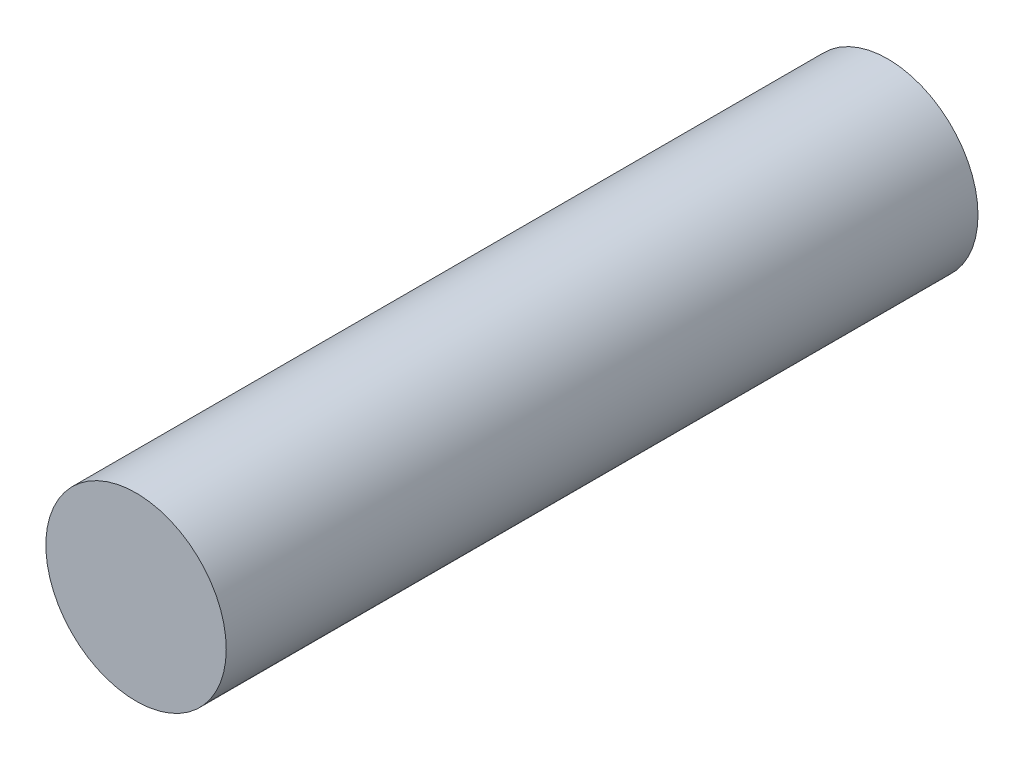
ISO-10303-21;
HEADER;
FILE_DESCRIPTION(('STEP AP214'),'2;1');
FILE_NAME('part.step','',(''),(''),'','','');
FILE_SCHEMA(('AUTOMOTIVE_DESIGN { 1 0 10303 214 1 1 1 1 }'));
ENDSEC;
DATA;
#1=APPLICATION_CONTEXT('core data for automotive mechanical design processes');
#2=APPLICATION_PROTOCOL_DEFINITION('international standard','automotive_design',2000,#1);
#3=PRODUCT_CONTEXT('',#1,'mechanical');
#4=PRODUCT('Part','Part','',(#3));
#5=PRODUCT_RELATED_PRODUCT_CATEGORY('part','',(#4));
#6=PRODUCT_DEFINITION_FORMATION('','',#4);
#7=PRODUCT_DEFINITION_CONTEXT('part definition',#1,'design');
#8=PRODUCT_DEFINITION('design','',#6,#7);
#9=PRODUCT_DEFINITION_SHAPE('','',#8);
#10=(LENGTH_UNIT() NAMED_UNIT(*) SI_UNIT(.MILLI.,.METRE.));
#11=(NAMED_UNIT(*) PLANE_ANGLE_UNIT() SI_UNIT($,.RADIAN.));
#12=(NAMED_UNIT(*) SI_UNIT($,.STERADIAN.) SOLID_ANGLE_UNIT());
#13=UNCERTAINTY_MEASURE_WITH_UNIT(LENGTH_MEASURE(1.E-05),#10,'distance_accuracy_value','');
#14=(GEOMETRIC_REPRESENTATION_CONTEXT(3) GLOBAL_UNCERTAINTY_ASSIGNED_CONTEXT((#13)) GLOBAL_UNIT_ASSIGNED_CONTEXT((#10,
#11,#12)) REPRESENTATION_CONTEXT('',''));
#15=CARTESIAN_POINT('',(0.,0.,0.));
#16=DIRECTION('',(0.,0.,1.));
#17=DIRECTION('',(1.,0.,0.));
#18=AXIS2_PLACEMENT_3D('',#15,#16,#17);
#19=CARTESIAN_POINT('',(0.,0.,15.));
#20=DIRECTION('',(0.,0.,-1.));
#21=DIRECTION('',(-1.,0.,0.));
#22=AXIS2_PLACEMENT_3D('',#19,#20,#21);
#23=CYLINDRICAL_SURFACE('',#22,1.8);
#24=CARTESIAN_POINT('',(0.,0.,15.));
#25=DIRECTION('',(0.,0.,1.));
#26=DIRECTION('',(1.,0.,0.));
#27=AXIS2_PLACEMENT_3D('',#24,#25,#26);
#28=CIRCLE('',#27,1.8);
#29=CARTESIAN_POINT('',(1.8,0.,15.));
#30=VERTEX_POINT('',#29);
#31=EDGE_CURVE('E10',#30,#30,#28,.T.);
#32=ORIENTED_EDGE('',*,*,#31,.F.);
#33=EDGE_LOOP('',(#32));
#34=FACE_BOUND('',#33,.T.);
#35=CARTESIAN_POINT('',(0.,0.,0.));
#36=DIRECTION('',(0.,0.,1.));
#37=DIRECTION('',(1.,0.,0.));
#38=AXIS2_PLACEMENT_3D('',#35,#36,#37);
#39=CIRCLE('',#38,1.8);
#40=CARTESIAN_POINT('',(1.8,0.,0.));
#41=VERTEX_POINT('',#40);
#42=EDGE_CURVE('E40',#41,#41,#39,.T.);
#43=ORIENTED_EDGE('',*,*,#42,.T.);
#44=EDGE_LOOP('',(#43));
#45=FACE_BOUND('',#44,.T.);
#46=ADVANCED_FACE('F37',(#34,#45),#23,.T.);
#47=CARTESIAN_POINT('',(0.,0.,15.));
#48=DIRECTION('',(0.,0.,1.));
#49=DIRECTION('',(1.,0.,0.));
#50=AXIS2_PLACEMENT_3D('',#47,#48,#49);
#51=PLANE('',#50);
#52=ORIENTED_EDGE('',*,*,#31,.T.);
#53=EDGE_LOOP('',(#52));
#54=FACE_BOUND('',#53,.T.);
#55=ADVANCED_FACE('F52',(#54),#51,.T.);
#56=CARTESIAN_POINT('',(0.,0.,0.));
#57=DIRECTION('',(0.,0.,1.));
#58=DIRECTION('',(1.,0.,0.));
#59=AXIS2_PLACEMENT_3D('',#56,#57,#58);
#60=PLANE('',#59);
#61=ORIENTED_EDGE('',*,*,#42,.F.);
#62=EDGE_LOOP('',(#61));
#63=FACE_BOUND('',#62,.T.);
#64=ADVANCED_FACE('F50',(#63),#60,.F.);
#65=CLOSED_SHELL('',(#46,#55,#64));
#66=MANIFOLD_SOLID_BREP('B2',#65);
#67=ADVANCED_BREP_SHAPE_REPRESENTATION('',(#18,#66),#14);
#68=SHAPE_DEFINITION_REPRESENTATION(#9,#67);
ENDSEC;
END-ISO-10303-21;
